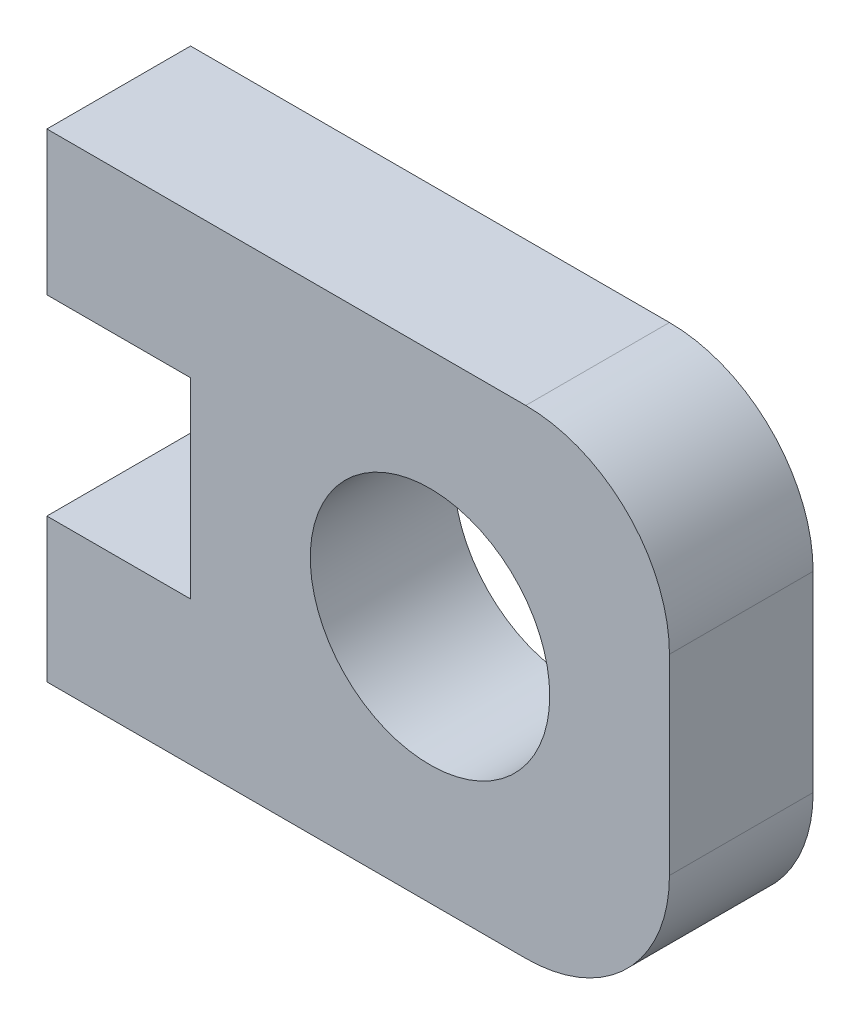
ISO-10303-21;
HEADER;
FILE_DESCRIPTION(('STEP AP214'),'2;1');
FILE_NAME('part.step','',(''),(''),'','','');
FILE_SCHEMA(('AUTOMOTIVE_DESIGN { 1 0 10303 214 1 1 1 1 }'));
ENDSEC;
DATA;
#1=APPLICATION_CONTEXT('core data for automotive mechanical design processes');
#2=APPLICATION_PROTOCOL_DEFINITION('international standard','automotive_design',2000,#1);
#3=PRODUCT_CONTEXT('',#1,'mechanical');
#4=PRODUCT('Part','Part','',(#3));
#5=PRODUCT_RELATED_PRODUCT_CATEGORY('part','',(#4));
#6=PRODUCT_DEFINITION_FORMATION('','',#4);
#7=PRODUCT_DEFINITION_CONTEXT('part definition',#1,'design');
#8=PRODUCT_DEFINITION('design','',#6,#7);
#9=PRODUCT_DEFINITION_SHAPE('','',#8);
#10=(LENGTH_UNIT() NAMED_UNIT(*) SI_UNIT(.MILLI.,.METRE.));
#11=(NAMED_UNIT(*) PLANE_ANGLE_UNIT() SI_UNIT($,.RADIAN.));
#12=(NAMED_UNIT(*) SI_UNIT($,.STERADIAN.) SOLID_ANGLE_UNIT());
#13=UNCERTAINTY_MEASURE_WITH_UNIT(LENGTH_MEASURE(1.E-05),#10,'distance_accuracy_value','');
#14=(GEOMETRIC_REPRESENTATION_CONTEXT(3) GLOBAL_UNCERTAINTY_ASSIGNED_CONTEXT((#13)) GLOBAL_UNIT_ASSIGNED_CONTEXT((#10,
#11,#12)) REPRESENTATION_CONTEXT('',''));
#15=CARTESIAN_POINT('',(0.,0.,0.));
#16=DIRECTION('',(0.,0.,1.));
#17=DIRECTION('',(1.,0.,0.));
#18=AXIS2_PLACEMENT_3D('',#15,#16,#17);
#19=CARTESIAN_POINT('',(10.,7.,3.));
#20=DIRECTION('',(0.,0.,-1.));
#21=DIRECTION('',(-1.,0.,0.));
#22=AXIS2_PLACEMENT_3D('',#19,#20,#21);
#23=PLANE('',#22);
#24=DIRECTION('',(0.,-1.,0.));
#25=VECTOR('',#24,1.);
#26=CARTESIAN_POINT('',(0.,0.,3.));
#27=LINE('',#26,#25);
#28=CARTESIAN_POINT('',(0.,3.,3.));
#29=VERTEX_POINT('',#28);
#30=CARTESIAN_POINT('',(0.,0.,3.));
#31=VERTEX_POINT('',#30);
#32=EDGE_CURVE('E160',#29,#31,#27,.T.);
#33=ORIENTED_EDGE('',*,*,#32,.T.);
#34=DIRECTION('',(1.,0.,0.));
#35=VECTOR('',#34,1.);
#36=CARTESIAN_POINT('',(9.99999999999998,0.,3.));
#37=LINE('',#36,#35);
#38=CARTESIAN_POINT('',(9.99999999999998,0.,3.));
#39=VERTEX_POINT('',#38);
#40=EDGE_CURVE('E98',#31,#39,#37,.T.);
#41=ORIENTED_EDGE('',*,*,#40,.T.);
#42=CARTESIAN_POINT('',(10.,3.,3.));
#43=DIRECTION('',(0.,0.,1.));
#44=DIRECTION('',(1.,0.,0.));
#45=AXIS2_PLACEMENT_3D('',#42,#43,#44);
#46=CIRCLE('',#45,3.);
#47=CARTESIAN_POINT('',(13.,3.,3.));
#48=VERTEX_POINT('',#47);
#49=EDGE_CURVE('E181',#39,#48,#46,.T.);
#50=ORIENTED_EDGE('',*,*,#49,.T.);
#51=DIRECTION('',(0.,1.,0.));
#52=VECTOR('',#51,1.);
#53=CARTESIAN_POINT('',(13.,6.99999999999998,3.));
#54=LINE('',#53,#52);
#55=CARTESIAN_POINT('',(13.,6.99999999999998,3.));
#56=VERTEX_POINT('',#55);
#57=EDGE_CURVE('E200',#48,#56,#54,.T.);
#58=ORIENTED_EDGE('',*,*,#57,.T.);
#59=CARTESIAN_POINT('',(10.,7.,3.));
#60=DIRECTION('',(0.,0.,1.));
#61=DIRECTION('',(-1.,0.,0.));
#62=AXIS2_PLACEMENT_3D('',#59,#60,#61);
#63=CIRCLE('',#62,3.);
#64=CARTESIAN_POINT('',(9.99999999999997,10.,3.));
#65=VERTEX_POINT('',#64);
#66=EDGE_CURVE('E197',#56,#65,#63,.T.);
#67=ORIENTED_EDGE('',*,*,#66,.T.);
#68=DIRECTION('',(-1.,0.,0.));
#69=VECTOR('',#68,1.);
#70=CARTESIAN_POINT('',(0.,10.,3.));
#71=LINE('',#70,#69);
#72=CARTESIAN_POINT('',(0.,10.,3.));
#73=VERTEX_POINT('',#72);
#74=EDGE_CURVE('E199',#65,#73,#71,.T.);
#75=ORIENTED_EDGE('',*,*,#74,.T.);
#76=DIRECTION('',(0.,-1.,0.));
#77=VECTOR('',#76,1.);
#78=CARTESIAN_POINT('',(0.,10.,3.));
#79=LINE('',#78,#77);
#80=CARTESIAN_POINT('',(0.,7.,3.));
#81=VERTEX_POINT('',#80);
#82=EDGE_CURVE('E123',#73,#81,#79,.T.);
#83=ORIENTED_EDGE('',*,*,#82,.T.);
#84=DIRECTION('',(1.,0.,0.));
#85=VECTOR('',#84,1.);
#86=CARTESIAN_POINT('',(0.,7.,3.));
#87=LINE('',#86,#85);
#88=CARTESIAN_POINT('',(3.,7.,3.));
#89=VERTEX_POINT('',#88);
#90=EDGE_CURVE('E117',#81,#89,#87,.T.);
#91=ORIENTED_EDGE('',*,*,#90,.T.);
#92=DIRECTION('',(0.,-1.,0.));
#93=VECTOR('',#92,1.);
#94=CARTESIAN_POINT('',(3.,7.,3.));
#95=LINE('',#94,#93);
#96=CARTESIAN_POINT('',(3.,3.,3.));
#97=VERTEX_POINT('',#96);
#98=EDGE_CURVE('E121',#89,#97,#95,.T.);
#99=ORIENTED_EDGE('',*,*,#98,.T.);
#100=DIRECTION('',(-1.,0.,0.));
#101=VECTOR('',#100,1.);
#102=CARTESIAN_POINT('',(0.,3.,3.));
#103=LINE('',#102,#101);
#104=EDGE_CURVE('E49',#97,#29,#103,.T.);
#105=ORIENTED_EDGE('',*,*,#104,.T.);
#106=EDGE_LOOP('',(#33,#41,#50,#58,#67,#75,#83,#91,#99,#105));
#107=FACE_BOUND('',#106,.T.);
#108=CARTESIAN_POINT('',(8.,5.,3.));
#109=DIRECTION('',(0.,0.,1.));
#110=DIRECTION('',(1.,0.,0.));
#111=AXIS2_PLACEMENT_3D('',#108,#109,#110);
#112=CIRCLE('',#111,2.5);
#113=CARTESIAN_POINT('',(10.5,5.,3.));
#114=VERTEX_POINT('',#113);
#115=EDGE_CURVE('E145',#114,#114,#112,.T.);
#116=ORIENTED_EDGE('',*,*,#115,.F.);
#117=EDGE_LOOP('',(#116));
#118=FACE_BOUND('',#117,.T.);
#119=ADVANCED_FACE('F32',(#107,#118),#23,.F.);
#120=CARTESIAN_POINT('',(10.,7.,0.));
#121=DIRECTION('',(0.,0.,-1.));
#122=DIRECTION('',(-1.,0.,0.));
#123=AXIS2_PLACEMENT_3D('',#120,#121,#122);
#124=PLANE('',#123);
#125=DIRECTION('',(0.,-1.,0.));
#126=VECTOR('',#125,1.);
#127=CARTESIAN_POINT('',(0.,0.,0.));
#128=LINE('',#127,#126);
#129=CARTESIAN_POINT('',(0.,3.,0.));
#130=VERTEX_POINT('',#129);
#131=CARTESIAN_POINT('',(0.,0.,0.));
#132=VERTEX_POINT('',#131);
#133=EDGE_CURVE('E141',#130,#132,#128,.T.);
#134=ORIENTED_EDGE('',*,*,#133,.F.);
#135=DIRECTION('',(-1.,0.,0.));
#136=VECTOR('',#135,1.);
#137=CARTESIAN_POINT('',(0.,3.,0.));
#138=LINE('',#137,#136);
#139=CARTESIAN_POINT('',(3.,3.,0.));
#140=VERTEX_POINT('',#139);
#141=EDGE_CURVE('E90',#140,#130,#138,.T.);
#142=ORIENTED_EDGE('',*,*,#141,.F.);
#143=DIRECTION('',(0.,-1.,0.));
#144=VECTOR('',#143,1.);
#145=CARTESIAN_POINT('',(3.,7.,0.));
#146=LINE('',#145,#144);
#147=CARTESIAN_POINT('',(3.,7.,0.));
#148=VERTEX_POINT('',#147);
#149=EDGE_CURVE('E84',#148,#140,#146,.T.);
#150=ORIENTED_EDGE('',*,*,#149,.F.);
#151=DIRECTION('',(1.,0.,0.));
#152=VECTOR('',#151,1.);
#153=CARTESIAN_POINT('',(0.,7.,0.));
#154=LINE('',#153,#152);
#155=CARTESIAN_POINT('',(0.,7.,0.));
#156=VERTEX_POINT('',#155);
#157=EDGE_CURVE('E131',#156,#148,#154,.T.);
#158=ORIENTED_EDGE('',*,*,#157,.F.);
#159=DIRECTION('',(0.,-1.,0.));
#160=VECTOR('',#159,1.);
#161=CARTESIAN_POINT('',(0.,10.,0.));
#162=LINE('',#161,#160);
#163=CARTESIAN_POINT('',(0.,10.,0.));
#164=VERTEX_POINT('',#163);
#165=EDGE_CURVE('E155',#164,#156,#162,.T.);
#166=ORIENTED_EDGE('',*,*,#165,.F.);
#167=DIRECTION('',(-1.,0.,0.));
#168=VECTOR('',#167,1.);
#169=CARTESIAN_POINT('',(0.,10.,0.));
#170=LINE('',#169,#168);
#171=CARTESIAN_POINT('',(9.99999999999997,10.,0.));
#172=VERTEX_POINT('',#171);
#173=EDGE_CURVE('E153',#172,#164,#170,.T.);
#174=ORIENTED_EDGE('',*,*,#173,.F.);
#175=CARTESIAN_POINT('',(10.,7.,0.));
#176=DIRECTION('',(0.,0.,1.));
#177=DIRECTION('',(-1.,0.,0.));
#178=AXIS2_PLACEMENT_3D('',#175,#176,#177);
#179=CIRCLE('',#178,3.);
#180=CARTESIAN_POINT('',(13.,6.99999999999998,0.));
#181=VERTEX_POINT('',#180);
#182=EDGE_CURVE('E151',#181,#172,#179,.T.);
#183=ORIENTED_EDGE('',*,*,#182,.F.);
#184=DIRECTION('',(0.,1.,0.));
#185=VECTOR('',#184,1.);
#186=CARTESIAN_POINT('',(13.,6.99999999999998,0.));
#187=LINE('',#186,#185);
#188=CARTESIAN_POINT('',(13.,3.,0.));
#189=VERTEX_POINT('',#188);
#190=EDGE_CURVE('E149',#189,#181,#187,.T.);
#191=ORIENTED_EDGE('',*,*,#190,.F.);
#192=CARTESIAN_POINT('',(10.,3.,0.));
#193=DIRECTION('',(0.,0.,1.));
#194=DIRECTION('',(1.,0.,0.));
#195=AXIS2_PLACEMENT_3D('',#192,#193,#194);
#196=CIRCLE('',#195,3.);
#197=CARTESIAN_POINT('',(9.99999999999998,0.,0.));
#198=VERTEX_POINT('',#197);
#199=EDGE_CURVE('E147',#198,#189,#196,.T.);
#200=ORIENTED_EDGE('',*,*,#199,.F.);
#201=DIRECTION('',(1.,0.,0.));
#202=VECTOR('',#201,1.);
#203=CARTESIAN_POINT('',(9.99999999999998,0.,0.));
#204=LINE('',#203,#202);
#205=EDGE_CURVE('E144',#132,#198,#204,.T.);
#206=ORIENTED_EDGE('',*,*,#205,.F.);
#207=EDGE_LOOP('',(#134,#142,#150,#158,#166,#174,#183,#191,#200,#206));
#208=FACE_BOUND('',#207,.T.);
#209=CARTESIAN_POINT('',(8.,5.,0.));
#210=DIRECTION('',(0.,0.,1.));
#211=DIRECTION('',(1.,0.,0.));
#212=AXIS2_PLACEMENT_3D('',#209,#210,#211);
#213=CIRCLE('',#212,2.5);
#214=CARTESIAN_POINT('',(10.5,5.,0.));
#215=VERTEX_POINT('',#214);
#216=EDGE_CURVE('E208',#215,#215,#213,.T.);
#217=ORIENTED_EDGE('',*,*,#216,.T.);
#218=EDGE_LOOP('',(#217));
#219=FACE_BOUND('',#218,.T.);
#220=ADVANCED_FACE('F185',(#208,#219),#124,.T.);
#221=CARTESIAN_POINT('',(0.,0.,3.));
#222=DIRECTION('',(1.,0.,0.));
#223=DIRECTION('',(0.,0.,-1.));
#224=AXIS2_PLACEMENT_3D('',#221,#222,#223);
#225=PLANE('',#224);
#226=ORIENTED_EDGE('',*,*,#133,.T.);
#227=DIRECTION('',(0.,0.,-1.));
#228=VECTOR('',#227,1.);
#229=CARTESIAN_POINT('',(0.,0.,3.));
#230=LINE('',#229,#228);
#231=EDGE_CURVE('E11',#31,#132,#230,.T.);
#232=ORIENTED_EDGE('',*,*,#231,.F.);
#233=ORIENTED_EDGE('',*,*,#32,.F.);
#234=DIRECTION('',(0.,0.,-1.));
#235=VECTOR('',#234,1.);
#236=CARTESIAN_POINT('',(0.,3.,3.));
#237=LINE('',#236,#235);
#238=EDGE_CURVE('E137',#29,#130,#237,.T.);
#239=ORIENTED_EDGE('',*,*,#238,.T.);
#240=EDGE_LOOP('',(#226,#232,#233,#239));
#241=FACE_BOUND('',#240,.T.);
#242=ADVANCED_FACE('F34',(#241),#225,.F.);
#243=CARTESIAN_POINT('',(9.99999999999998,0.,3.));
#244=DIRECTION('',(0.,1.,0.));
#245=DIRECTION('',(-1.,0.,0.));
#246=AXIS2_PLACEMENT_3D('',#243,#244,#245);
#247=PLANE('',#246);
#248=ORIENTED_EDGE('',*,*,#205,.T.);
#249=DIRECTION('',(0.,0.,-1.));
#250=VECTOR('',#249,1.);
#251=CARTESIAN_POINT('',(9.99999999999998,0.,3.));
#252=LINE('',#251,#250);
#253=EDGE_CURVE('E41',#39,#198,#252,.T.);
#254=ORIENTED_EDGE('',*,*,#253,.F.);
#255=ORIENTED_EDGE('',*,*,#40,.F.);
#256=ORIENTED_EDGE('',*,*,#231,.T.);
#257=EDGE_LOOP('',(#248,#254,#255,#256));
#258=FACE_BOUND('',#257,.T.);
#259=ADVANCED_FACE('F244',(#258),#247,.F.);
#260=CARTESIAN_POINT('',(10.,3.,3.));
#261=DIRECTION('',(0.,0.,-1.));
#262=DIRECTION('',(-1.,0.,0.));
#263=AXIS2_PLACEMENT_3D('',#260,#261,#262);
#264=CYLINDRICAL_SURFACE('',#263,3.);
#265=ORIENTED_EDGE('',*,*,#199,.T.);
#266=DIRECTION('',(0.,0.,-1.));
#267=VECTOR('',#266,1.);
#268=CARTESIAN_POINT('',(13.,3.,3.));
#269=LINE('',#268,#267);
#270=EDGE_CURVE('E173',#48,#189,#269,.T.);
#271=ORIENTED_EDGE('',*,*,#270,.F.);
#272=ORIENTED_EDGE('',*,*,#49,.F.);
#273=ORIENTED_EDGE('',*,*,#253,.T.);
#274=EDGE_LOOP('',(#265,#271,#272,#273));
#275=FACE_BOUND('',#274,.T.);
#276=ADVANCED_FACE('F179',(#275),#264,.T.);
#277=CARTESIAN_POINT('',(13.,6.99999999999998,3.));
#278=DIRECTION('',(-1.,0.,0.));
#279=DIRECTION('',(0.,-1.,0.));
#280=AXIS2_PLACEMENT_3D('',#277,#278,#279);
#281=PLANE('',#280);
#282=ORIENTED_EDGE('',*,*,#190,.T.);
#283=DIRECTION('',(0.,0.,-1.));
#284=VECTOR('',#283,1.);
#285=CARTESIAN_POINT('',(13.,6.99999999999998,3.));
#286=LINE('',#285,#284);
#287=EDGE_CURVE('E170',#56,#181,#286,.T.);
#288=ORIENTED_EDGE('',*,*,#287,.F.);
#289=ORIENTED_EDGE('',*,*,#57,.F.);
#290=ORIENTED_EDGE('',*,*,#270,.T.);
#291=EDGE_LOOP('',(#282,#288,#289,#290));
#292=FACE_BOUND('',#291,.T.);
#293=ADVANCED_FACE('F191',(#292),#281,.F.);
#294=CARTESIAN_POINT('',(10.,7.,3.));
#295=DIRECTION('',(0.,0.,-1.));
#296=DIRECTION('',(-1.,0.,0.));
#297=AXIS2_PLACEMENT_3D('',#294,#295,#296);
#298=CYLINDRICAL_SURFACE('',#297,3.);
#299=ORIENTED_EDGE('',*,*,#182,.T.);
#300=DIRECTION('',(0.,0.,-1.));
#301=VECTOR('',#300,1.);
#302=CARTESIAN_POINT('',(9.99999999999997,10.,3.));
#303=LINE('',#302,#301);
#304=EDGE_CURVE('E167',#65,#172,#303,.T.);
#305=ORIENTED_EDGE('',*,*,#304,.F.);
#306=ORIENTED_EDGE('',*,*,#66,.F.);
#307=ORIENTED_EDGE('',*,*,#287,.T.);
#308=EDGE_LOOP('',(#299,#305,#306,#307));
#309=FACE_BOUND('',#308,.T.);
#310=ADVANCED_FACE('F195',(#309),#298,.T.);
#311=CARTESIAN_POINT('',(0.,10.,3.));
#312=DIRECTION('',(0.,-1.,0.));
#313=DIRECTION('',(1.,0.,0.));
#314=AXIS2_PLACEMENT_3D('',#311,#312,#313);
#315=PLANE('',#314);
#316=ORIENTED_EDGE('',*,*,#173,.T.);
#317=DIRECTION('',(0.,0.,-1.));
#318=VECTOR('',#317,1.);
#319=CARTESIAN_POINT('',(0.,10.,3.));
#320=LINE('',#319,#318);
#321=EDGE_CURVE('E164',#73,#164,#320,.T.);
#322=ORIENTED_EDGE('',*,*,#321,.F.);
#323=ORIENTED_EDGE('',*,*,#74,.F.);
#324=ORIENTED_EDGE('',*,*,#304,.T.);
#325=EDGE_LOOP('',(#316,#322,#323,#324));
#326=FACE_BOUND('',#325,.T.);
#327=ADVANCED_FACE('F234',(#326),#315,.F.);
#328=CARTESIAN_POINT('',(0.,10.,3.));
#329=DIRECTION('',(1.,0.,0.));
#330=DIRECTION('',(0.,1.,0.));
#331=AXIS2_PLACEMENT_3D('',#328,#329,#330);
#332=PLANE('',#331);
#333=ORIENTED_EDGE('',*,*,#165,.T.);
#334=DIRECTION('',(0.,0.,-1.));
#335=VECTOR('',#334,1.);
#336=CARTESIAN_POINT('',(0.,7.,3.));
#337=LINE('',#336,#335);
#338=EDGE_CURVE('E132',#81,#156,#337,.T.);
#339=ORIENTED_EDGE('',*,*,#338,.F.);
#340=ORIENTED_EDGE('',*,*,#82,.F.);
#341=ORIENTED_EDGE('',*,*,#321,.T.);
#342=EDGE_LOOP('',(#333,#339,#340,#341));
#343=FACE_BOUND('',#342,.T.);
#344=ADVANCED_FACE('F231',(#343),#332,.F.);
#345=CARTESIAN_POINT('',(0.,7.,3.));
#346=DIRECTION('',(0.,1.,0.));
#347=DIRECTION('',(-1.,0.,0.));
#348=AXIS2_PLACEMENT_3D('',#345,#346,#347);
#349=PLANE('',#348);
#350=ORIENTED_EDGE('',*,*,#157,.T.);
#351=DIRECTION('',(0.,0.,-1.));
#352=VECTOR('',#351,1.);
#353=CARTESIAN_POINT('',(3.,7.,3.));
#354=LINE('',#353,#352);
#355=EDGE_CURVE('E128',#89,#148,#354,.T.);
#356=ORIENTED_EDGE('',*,*,#355,.F.);
#357=ORIENTED_EDGE('',*,*,#90,.F.);
#358=ORIENTED_EDGE('',*,*,#338,.T.);
#359=EDGE_LOOP('',(#350,#356,#357,#358));
#360=FACE_BOUND('',#359,.T.);
#361=ADVANCED_FACE('F129',(#360),#349,.F.);
#362=CARTESIAN_POINT('',(3.,7.,3.));
#363=DIRECTION('',(1.,0.,0.));
#364=DIRECTION('',(0.,1.,0.));
#365=AXIS2_PLACEMENT_3D('',#362,#363,#364);
#366=PLANE('',#365);
#367=ORIENTED_EDGE('',*,*,#149,.T.);
#368=DIRECTION('',(0.,0.,-1.));
#369=VECTOR('',#368,1.);
#370=CARTESIAN_POINT('',(3.,3.,3.));
#371=LINE('',#370,#369);
#372=EDGE_CURVE('E133',#97,#140,#371,.T.);
#373=ORIENTED_EDGE('',*,*,#372,.F.);
#374=ORIENTED_EDGE('',*,*,#98,.F.);
#375=ORIENTED_EDGE('',*,*,#355,.T.);
#376=EDGE_LOOP('',(#367,#373,#374,#375));
#377=FACE_BOUND('',#376,.T.);
#378=ADVANCED_FACE('F135',(#377),#366,.F.);
#379=CARTESIAN_POINT('',(0.,3.,3.));
#380=DIRECTION('',(0.,-1.,0.));
#381=DIRECTION('',(0.,0.,-1.));
#382=AXIS2_PLACEMENT_3D('',#379,#380,#381);
#383=PLANE('',#382);
#384=ORIENTED_EDGE('',*,*,#141,.T.);
#385=ORIENTED_EDGE('',*,*,#238,.F.);
#386=ORIENTED_EDGE('',*,*,#104,.F.);
#387=ORIENTED_EDGE('',*,*,#372,.T.);
#388=EDGE_LOOP('',(#384,#385,#386,#387));
#389=FACE_BOUND('',#388,.T.);
#390=ADVANCED_FACE('F224',(#389),#383,.F.);
#391=CARTESIAN_POINT('',(8.,5.,3.));
#392=DIRECTION('',(0.,0.,-1.));
#393=DIRECTION('',(-1.,0.,0.));
#394=AXIS2_PLACEMENT_3D('',#391,#392,#393);
#395=CYLINDRICAL_SURFACE('',#394,2.5);
#396=ORIENTED_EDGE('',*,*,#115,.T.);
#397=EDGE_LOOP('',(#396));
#398=FACE_BOUND('',#397,.T.);
#399=ORIENTED_EDGE('',*,*,#216,.F.);
#400=EDGE_LOOP('',(#399));
#401=FACE_BOUND('',#400,.T.);
#402=ADVANCED_FACE('F214',(#398,#401),#395,.F.);
#403=CLOSED_SHELL('',(#119,#220,#242,#259,#276,#293,#310,#327,#344,#361,#378,#390,#402));
#404=MANIFOLD_SOLID_BREP('B2',#403);
#405=ADVANCED_BREP_SHAPE_REPRESENTATION('',(#18,#404),#14);
#406=SHAPE_DEFINITION_REPRESENTATION(#9,#405);
ENDSEC;
END-ISO-10303-21;
